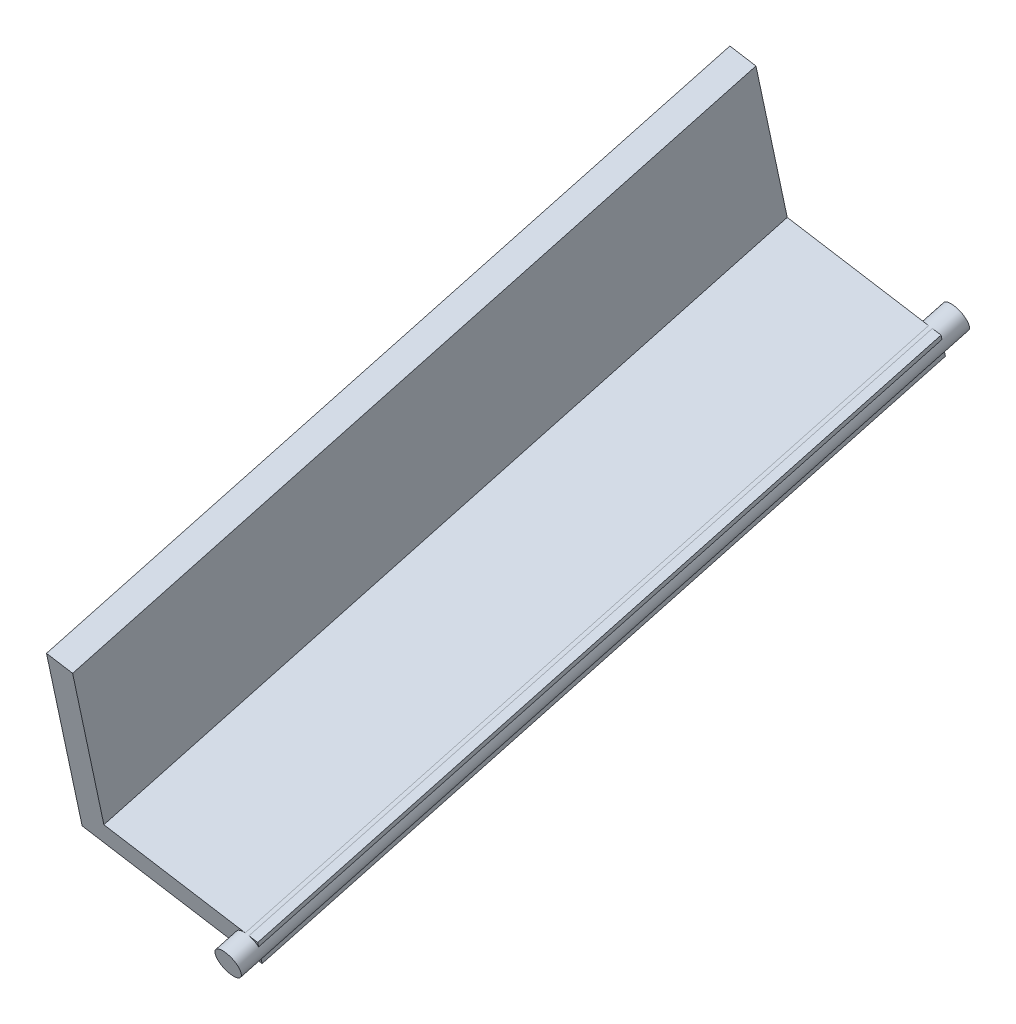
ISO-10303-21;
HEADER;
FILE_DESCRIPTION(('STEP AP214'),'2;1');
FILE_NAME('part.step','',(''),(''),'','','');
FILE_SCHEMA(('AUTOMOTIVE_DESIGN { 1 0 10303 214 1 1 1 1 }'));
ENDSEC;
DATA;
#1=APPLICATION_CONTEXT('core data for automotive mechanical design processes');
#2=APPLICATION_PROTOCOL_DEFINITION('international standard','automotive_design',2000,#1);
#3=PRODUCT_CONTEXT('',#1,'mechanical');
#4=PRODUCT('Part','Part','',(#3));
#5=PRODUCT_RELATED_PRODUCT_CATEGORY('part','',(#4));
#6=PRODUCT_DEFINITION_FORMATION('','',#4);
#7=PRODUCT_DEFINITION_CONTEXT('part definition',#1,'design');
#8=PRODUCT_DEFINITION('design','',#6,#7);
#9=PRODUCT_DEFINITION_SHAPE('','',#8);
#10=(LENGTH_UNIT() NAMED_UNIT(*) SI_UNIT(.MILLI.,.METRE.));
#11=(NAMED_UNIT(*) PLANE_ANGLE_UNIT() SI_UNIT($,.RADIAN.));
#12=(NAMED_UNIT(*) SI_UNIT($,.STERADIAN.) SOLID_ANGLE_UNIT());
#13=UNCERTAINTY_MEASURE_WITH_UNIT(LENGTH_MEASURE(1.E-05),#10,'distance_accuracy_value','');
#14=(GEOMETRIC_REPRESENTATION_CONTEXT(3) GLOBAL_UNCERTAINTY_ASSIGNED_CONTEXT((#13)) GLOBAL_UNIT_ASSIGNED_CONTEXT((#10,
#11,#12)) REPRESENTATION_CONTEXT('',''));
#15=CARTESIAN_POINT('',(0.,0.,0.));
#16=DIRECTION('',(0.,0.,1.));
#17=DIRECTION('',(1.,0.,0.));
#18=AXIS2_PLACEMENT_3D('',#15,#16,#17);
#19=CARTESIAN_POINT('',(135.49736529389,98.8824306192321,600.542544639561));
#20=DIRECTION('',(-0.0498209439146007,-0.318543912482936,0.94659793437738));
#21=DIRECTION('',(-0.986353849872011,0.164602515056017,0.00347776938496755));
#22=AXIS2_PLACEMENT_3D('',#19,#20,#21);
#23=PLANE('',#22);
#24=CARTESIAN_POINT('',(131.867470112503,96.4411580823011,599.529973964316));
#25=DIRECTION('',(-0.0498209439144848,-0.318543912482891,0.946597934377401));
#26=DIRECTION('',(0.,-0.947774913776361,-0.318939983094331));
#27=AXIS2_PLACEMENT_3D('',#24,#25,#26);
#28=CIRCLE('',#27,3.17499999999999);
#29=CARTESIAN_POINT('',(131.867470112503,93.4319727310612,598.517339517991));
#30=VERTEX_POINT('',#29);
#31=EDGE_CURVE('P0_E18',#30,#30,#28,.F.);
#32=ORIENTED_EDGE('',*,*,#31,.F.);
#33=EDGE_LOOP('',(#32));
#34=FACE_BOUND('',#33,.T.);
#35=ADVANCED_FACE('P0_F14',(#34),#23,.T.);
#36=CARTESIAN_POINT('',(143.264621387282,148.987783603308,431.985028772621));
#37=DIRECTION('',(0.0498209439146288,0.318543912482924,-0.946597934377382));
#38=DIRECTION('',(-0.986353849872009,0.164602515056032,0.00347776938494136));
#39=AXIS2_PLACEMENT_3D('',#36,#37,#38);
#40=PLANE('',#39);
#41=CARTESIAN_POINT('',(140.631169622001,152.474282110855,433.019683283465));
#42=DIRECTION('',(-0.0498209439144848,-0.318543912482891,0.946597934377401));
#43=DIRECTION('',(0.,-0.947774913776361,-0.318939983094331));
#44=AXIS2_PLACEMENT_3D('',#41,#42,#43);
#45=CIRCLE('',#44,3.17499999999999);
#46=CARTESIAN_POINT('',(140.631169622001,149.465096759615,432.00704883714));
#47=VERTEX_POINT('',#46);
#48=EDGE_CURVE('P0_E10',#47,#47,#45,.T.);
#49=ORIENTED_EDGE('',*,*,#48,.F.);
#50=EDGE_LOOP('',(#49));
#51=FACE_BOUND('',#50,.T.);
#52=ADVANCED_FACE('P0_F29',(#51),#40,.T.);
#53=CARTESIAN_POINT('',(140.631169622001,152.474282110855,433.019683283465));
#54=DIRECTION('',(-0.0498209439144848,-0.318543912482891,0.946597934377401));
#55=DIRECTION('',(0.,-0.947774913776361,-0.318939983094331));
#56=AXIS2_PLACEMENT_3D('',#53,#54,#55);
#57=CYLINDRICAL_SURFACE('',#56,3.17499999999999);
#58=ORIENTED_EDGE('',*,*,#31,.T.);
#59=EDGE_LOOP('',(#58));
#60=FACE_BOUND('',#59,.T.);
#61=ORIENTED_EDGE('',*,*,#48,.T.);
#62=EDGE_LOOP('',(#61));
#63=FACE_BOUND('',#62,.T.);
#64=ADVANCED_FACE('P0_F16',(#60,#63),#57,.T.);
#65=CLOSED_SHELL('',(#35,#52,#64));
#66=MANIFOLD_SOLID_BREP('P0_B1',#65);
#67=CARTESIAN_POINT('',(134.178484930313,94.6374337130501,593.668993032227));
#68=DIRECTION('',(0.0498209205864811,0.31854391637594,-0.946597934295123));
#69=DIRECTION('',(-0.98635385105032,0.164602507522178,0.00347779177282726));
#70=AXIS2_PLACEMENT_3D('',#67,#68,#69);
#71=PLANE('',#70);
#72=DIRECTION('',(-0.156920223011995,-0.933507251100535,-0.322397667101654));
#73=VECTOR('',#72,1.);
#74=CARTESIAN_POINT('',(134.676706638376,97.6013192352939,594.692605625277));
#75=LINE('',#74,#73);
#76=CARTESIAN_POINT('',(135.174928346438,100.565204757538,595.716218218324));
#77=VERTEX_POINT('',#76);
#78=CARTESIAN_POINT('',(134.17848493114,94.6374337183536,593.668993015742));
#79=VERTEX_POINT('',#78);
#80=EDGE_CURVE('P1_E143',#77,#79,#75,.T.);
#81=ORIENTED_EDGE('',*,*,#80,.F.);
#82=DIRECTION('',(0.98635385105032,-0.164602507522177,-0.00347779177281395));
#83=VECTOR('',#82,1.);
#84=CARTESIAN_POINT('',(116.725209396433,103.644089682068,595.781270208244));
#85=LINE('',#84,#83);
#86=CARTESIAN_POINT('',(98.2754904464275,106.722974606597,595.846322198162));
#87=VERTEX_POINT('',#86);
#88=EDGE_CURVE('P1_E155',#87,#77,#85,.T.);
#89=ORIENTED_EDGE('',*,*,#88,.F.);
#90=DIRECTION('',(-0.156920223011969,-0.933507251100538,-0.322397667101656));
#91=VECTOR('',#90,1.);
#92=CARTESIAN_POINT('',(101.844907972853,127.957185718248,603.179805807495));
#93=LINE('',#92,#91);
#94=CARTESIAN_POINT('',(105.414325499278,149.191396829899,610.513289416829));
#95=VERTEX_POINT('',#94);
#96=EDGE_CURVE('P1_E163',#95,#87,#93,.T.);
#97=ORIENTED_EDGE('',*,*,#96,.F.);
#98=DIRECTION('',(0.986353851050317,-0.164602507522197,-0.0034777917728332));
#99=VECTOR('',#98,1.);
#100=CARTESIAN_POINT('',(102.282652022193,149.714009791282,610.524331405707));
#101=LINE('',#100,#99);
#102=CARTESIAN_POINT('',(99.1509785451081,150.236622752665,610.535373394586));
#103=VERTEX_POINT('',#102);
#104=EDGE_CURVE('P1_E92',#103,#95,#101,.T.);
#105=ORIENTED_EDGE('',*,*,#104,.F.);
#106=DIRECTION('',(0.156920223011939,0.933507251100546,0.322397667101649));
#107=VECTOR('',#106,1.);
#108=CARTESIAN_POINT('',(95.5815610186831,129.002411641015,603.201889785252));
#109=LINE('',#108,#107);
#110=CARTESIAN_POINT('',(92.0119416850488,107.768234206907,595.868406887467));
#111=VERTEX_POINT('',#110);
#112=EDGE_CURVE('P1_E89',#111,#103,#109,.T.);
#113=ORIENTED_EDGE('',*,*,#112,.F.);
#114=DIRECTION('',(0.156920223011983,0.933507251100522,0.322397667101696));
#115=VECTOR('',#114,1.);
#116=CARTESIAN_POINT('',(91.5135181697758,104.804382362202,594.844795005978));
#117=LINE('',#116,#115);
#118=CARTESIAN_POINT('',(91.0152964608829,101.84049683463,593.821182429492));
#119=VERTEX_POINT('',#118);
#120=EDGE_CURVE('P1_E74',#119,#111,#117,.T.);
#121=ORIENTED_EDGE('',*,*,#120,.F.);
#122=DIRECTION('',(-0.98635385110461,0.164602507172809,0.00347779291085489));
#123=VECTOR('',#122,1.);
#124=CARTESIAN_POINT('',(112.645479282485,98.2308568241855,593.744916403752));
#125=LINE('',#124,#123);
#126=EDGE_CURVE('P1_E139',#79,#119,#125,.T.);
#127=ORIENTED_EDGE('',*,*,#126,.F.);
#128=EDGE_LOOP('',(#81,#89,#97,#105,#113,#121,#127));
#129=FACE_BOUND('',#128,.T.);
#130=ADVANCED_FACE('P1_F16',(#129),#71,.F.);
#131=CARTESIAN_POINT('',(100.236478552822,160.355372500133,439.598445247426));
#132=DIRECTION('',(-0.986353848704734,0.164602522519324,0.00347774720676038));
#133=DIRECTION('',(-0.156920223011967,-0.933507251100544,-0.322397667101641));
#134=AXIS2_PLACEMENT_3D('',#131,#132,#133);
#135=PLANE('',#134);
#136=ORIENTED_EDGE('',*,*,#120,.T.);
#137=CARTESIAN_POINT('',(100.236882167242,160.355305145051,439.598443824319));
#138=DIRECTION('',(-0.0498209670242729,-0.318543908626413,0.946597934458856));
#139=VECTOR('',#138,1.);
#140=LINE('',#137,#139);
#141=CARTESIAN_POINT('',(100.236680360033,160.355338822593,439.598444535868));
#142=VERTEX_POINT('',#141);
#143=EDGE_CURVE('P1_E79',#142,#111,#140,.T.);
#144=ORIENTED_EDGE('',*,*,#143,.F.);
#145=DIRECTION('',(0.15692022301197,0.933507251100538,0.322397667101658));
#146=VECTOR('',#145,1.);
#147=CARTESIAN_POINT('',(103.307674371185,178.625698089539,445.908316263713));
#148=LINE('',#147,#146);
#149=CARTESIAN_POINT('',(99.2400351366972,154.427601455644,437.551220061331));
#150=VERTEX_POINT('',#149);
#151=EDGE_CURVE('P1_E141',#150,#142,#148,.T.);
#152=ORIENTED_EDGE('',*,*,#151,.F.);
#153=DIRECTION('',(0.049820967024273,0.318543908626413,-0.946597934458856));
#154=VECTOR('',#153,1.);
#155=CARTESIAN_POINT('',(95.1276657992058,128.134049147801,515.686201237132));
#156=LINE('',#155,#154);
#157=EDGE_CURVE('P1_E83',#119,#150,#156,.T.);
#158=ORIENTED_EDGE('',*,*,#157,.F.);
#159=EDGE_LOOP('',(#136,#144,#152,#158));
#160=FACE_BOUND('',#159,.T.);
#161=ADVANCED_FACE('P1_F76',(#160),#135,.T.);
#162=CARTESIAN_POINT('',(107.375717220091,202.823727368353,454.265411042987));
#163=DIRECTION('',(-0.986353848704738,0.164602522519304,0.0034777472067533));
#164=DIRECTION('',(-0.156920223011944,-0.933507251100541,-0.322397667101661));
#165=AXIS2_PLACEMENT_3D('',#162,#163,#164);
#166=PLANE('',#165);
#167=ORIENTED_EDGE('',*,*,#112,.T.);
#168=DIRECTION('',(-0.049820967024273,-0.318543908626413,0.946597934458856));
#169=VECTOR('',#168,1.);
#170=CARTESIAN_POINT('',(103.2633478826,176.530175060508,532.400392218786));
#171=LINE('',#170,#169);
#172=CARTESIAN_POINT('',(107.375717220092,202.823727368351,454.265411042987));
#173=VERTEX_POINT('',#172);
#174=EDGE_CURVE('P1_E95',#173,#103,#171,.T.);
#175=ORIENTED_EDGE('',*,*,#174,.F.);
#176=DIRECTION('',(0.156920223011973,0.933507251100535,0.322397667101664));
#177=VECTOR('',#176,1.);
#178=CARTESIAN_POINT('',(103.308077985604,178.625630734457,445.908314840606));
#179=LINE('',#178,#177);
#180=EDGE_CURVE('P1_E99',#142,#173,#179,.T.);
#181=ORIENTED_EDGE('',*,*,#180,.F.);
#182=ORIENTED_EDGE('',*,*,#143,.T.);
#183=EDGE_LOOP('',(#167,#175,#181,#182));
#184=FACE_BOUND('',#183,.T.);
#185=ADVANCED_FACE('P1_F97',(#184),#166,.T.);
#186=CARTESIAN_POINT('',(113.639064174262,201.778501445586,454.243327065229));
#187=DIRECTION('',(0.156920223011942,0.933507251100542,0.32239766710166));
#188=DIRECTION('',(-0.98635385105032,0.164602507522179,0.00347779177280696));
#189=AXIS2_PLACEMENT_3D('',#186,#187,#188);
#190=PLANE('',#189);
#191=ORIENTED_EDGE('',*,*,#104,.T.);
#192=DIRECTION('',(-0.0498209670242729,-0.318543908626413,0.946597934458856));
#193=VECTOR('',#192,1.);
#194=CARTESIAN_POINT('',(109.52669483677,175.484949137742,532.37830824103));
#195=LINE('',#194,#193);
#196=CARTESIAN_POINT('',(113.639064174262,201.778501445586,454.24332706523));
#197=VERTEX_POINT('',#196);
#198=EDGE_CURVE('P1_E165',#197,#95,#195,.T.);
#199=ORIENTED_EDGE('',*,*,#198,.F.);
#200=DIRECTION('',(0.986353851050323,-0.164602507522157,-0.00347779177280873));
#201=VECTOR('',#200,1.);
#202=CARTESIAN_POINT('',(128.956907839972,199.222263159981,454.189317775743));
#203=LINE('',#202,#201);
#204=EDGE_CURVE('P1_E168',#173,#197,#203,.T.);
#205=ORIENTED_EDGE('',*,*,#204,.F.);
#206=ORIENTED_EDGE('',*,*,#174,.T.);
#207=EDGE_LOOP('',(#191,#199,#205,#206));
#208=FACE_BOUND('',#207,.T.);
#209=ADVANCED_FACE('P1_F117',(#208),#190,.T.);
#210=CARTESIAN_POINT('',(106.500229121412,159.310079222284,439.576359846562));
#211=DIRECTION('',(0.986353848704737,-0.164602522519305,-0.0034777472067537));
#212=DIRECTION('',(0.156920223011945,0.933507251100541,0.32239766710166));
#213=AXIS2_PLACEMENT_3D('',#210,#211,#212);
#214=PLANE('',#213);
#215=ORIENTED_EDGE('',*,*,#96,.T.);
#216=DIRECTION('',(-0.049820967024273,-0.318543908626414,0.946597934458856));
#217=VECTOR('',#216,1.);
#218=CARTESIAN_POINT('',(102.387859783919,133.016526914441,517.711341022363));
#219=LINE('',#218,#217);
#220=CARTESIAN_POINT('',(106.500229121411,159.310079222284,439.576359846562));
#221=VERTEX_POINT('',#220);
#222=EDGE_CURVE('P1_E157',#221,#87,#219,.T.);
#223=ORIENTED_EDGE('',*,*,#222,.F.);
#224=DIRECTION('',(-0.156920223011968,-0.933507251100536,-0.322397667101662));
#225=VECTOR('',#224,1.);
#226=CARTESIAN_POINT('',(109.571424939774,177.580404811691,445.886230862848));
#227=LINE('',#226,#225);
#228=EDGE_CURVE('P1_E160',#197,#221,#227,.T.);
#229=ORIENTED_EDGE('',*,*,#228,.F.);
#230=ORIENTED_EDGE('',*,*,#198,.T.);
#231=EDGE_LOOP('',(#215,#223,#229,#230));
#232=FACE_BOUND('',#231,.T.);
#233=ADVANCED_FACE('P1_F120',(#232),#214,.T.);
#234=CARTESIAN_POINT('',(143.399667021421,153.152309373226,439.446255866726));
#235=DIRECTION('',(0.156920223011947,0.933507251100541,0.322397667101659));
#236=DIRECTION('',(-0.986353851050319,0.164602507522179,0.00347779177282272));
#237=AXIS2_PLACEMENT_3D('',#234,#235,#236);
#238=PLANE('',#237);
#239=ORIENTED_EDGE('',*,*,#88,.T.);
#240=DIRECTION('',(-0.0498209670242729,-0.318543908626413,0.946597934458857));
#241=VECTOR('',#240,1.);
#242=CARTESIAN_POINT('',(139.287297683931,126.858757065381,517.581237042525));
#243=LINE('',#242,#241);
#244=CARTESIAN_POINT('',(143.399667021422,153.152309373225,439.446255866724));
#245=VERTEX_POINT('',#244);
#246=EDGE_CURVE('P1_E149',#245,#77,#243,.T.);
#247=ORIENTED_EDGE('',*,*,#246,.F.);
#248=DIRECTION('',(0.986353851050321,-0.164602507522171,-0.00347779177281976));
#249=VECTOR('',#248,1.);
#250=CARTESIAN_POINT('',(121.818072787123,156.753840936679,439.522350557075));
#251=LINE('',#250,#249);
#252=EDGE_CURVE('P1_E152',#221,#245,#251,.T.);
#253=ORIENTED_EDGE('',*,*,#252,.F.);
#254=ORIENTED_EDGE('',*,*,#222,.T.);
#255=EDGE_LOOP('',(#239,#247,#253,#254));
#256=FACE_BOUND('',#255,.T.);
#257=ADVANCED_FACE('P1_F124',(#256),#238,.T.);
#258=CARTESIAN_POINT('',(142.403223605296,147.224538328736,437.39903068063));
#259=DIRECTION('',(0.986353848704735,-0.164602522519317,-0.00347774720675811));
#260=DIRECTION('',(0.156920223011958,0.933507251100536,0.322397667101667));
#261=AXIS2_PLACEMENT_3D('',#258,#259,#260);
#262=PLANE('',#261);
#263=ORIENTED_EDGE('',*,*,#80,.T.);
#264=DIRECTION('',(-0.0498209670242729,-0.318543908626413,0.946597934458856));
#265=VECTOR('',#264,1.);
#266=CARTESIAN_POINT('',(138.290854267805,120.930986020893,515.534011856429));
#267=LINE('',#266,#265);
#268=CARTESIAN_POINT('',(142.403223605415,147.224538329494,437.399030678379));
#269=VERTEX_POINT('',#268);
#270=EDGE_CURVE('P1_E37',#269,#79,#267,.T.);
#271=ORIENTED_EDGE('',*,*,#270,.F.);
#272=DIRECTION('',(-0.156920223011972,-0.933507251100537,-0.322397667101659));
#273=VECTOR('',#272,1.);
#274=CARTESIAN_POINT('',(146.470862839784,171.422634962632,445.75612688301));
#275=LINE('',#274,#273);
#276=EDGE_CURVE('P1_E28',#245,#269,#275,.T.);
#277=ORIENTED_EDGE('',*,*,#276,.F.);
#278=ORIENTED_EDGE('',*,*,#246,.T.);
#279=EDGE_LOOP('',(#263,#271,#277,#278));
#280=FACE_BOUND('',#279,.T.);
#281=ADVANCED_FACE('P1_F128',(#280),#262,.T.);
#282=CARTESIAN_POINT('',(99.2400351366976,154.427601455644,437.551220061332));
#283=DIRECTION('',(-0.156920223011949,-0.933507251100541,-0.322397667101659));
#284=DIRECTION('',(0.986353851050319,-0.16460250752218,-0.00347779177282727));
#285=AXIS2_PLACEMENT_3D('',#282,#283,#284);
#286=PLANE('',#285);
#287=ORIENTED_EDGE('',*,*,#126,.T.);
#288=ORIENTED_EDGE('',*,*,#157,.T.);
#289=DIRECTION('',(-0.986353851050321,0.16460250752217,0.00347779177281978));
#290=VECTOR('',#289,1.);
#291=CARTESIAN_POINT('',(120.821629370997,150.826069892191,437.475125370979));
#292=LINE('',#291,#290);
#293=EDGE_CURVE('P1_E11',#269,#150,#292,.T.);
#294=ORIENTED_EDGE('',*,*,#293,.F.);
#295=ORIENTED_EDGE('',*,*,#270,.T.);
#296=EDGE_LOOP('',(#287,#288,#294,#295));
#297=FACE_BOUND('',#296,.T.);
#298=ADVANCED_FACE('P1_F131',(#297),#286,.T.);
#299=CARTESIAN_POINT('',(142.403223605297,147.224538328737,437.399030680628));
#300=DIRECTION('',(0.0498209205864826,0.318543916375943,-0.946597934295122));
#301=DIRECTION('',(-0.98635385105032,0.164602507522177,0.00347779177282599));
#302=AXIS2_PLACEMENT_3D('',#299,#300,#301);
#303=PLANE('',#302);
#304=ORIENTED_EDGE('',*,*,#276,.T.);
#305=ORIENTED_EDGE('',*,*,#293,.T.);
#306=ORIENTED_EDGE('',*,*,#151,.T.);
#307=ORIENTED_EDGE('',*,*,#180,.T.);
#308=ORIENTED_EDGE('',*,*,#204,.T.);
#309=ORIENTED_EDGE('',*,*,#228,.T.);
#310=ORIENTED_EDGE('',*,*,#252,.T.);
#311=EDGE_LOOP('',(#304,#305,#306,#307,#308,#309,#310));
#312=FACE_BOUND('',#311,.T.);
#313=ADVANCED_FACE('P1_F18',(#312),#303,.T.);
#314=CLOSED_SHELL('',(#130,#161,#185,#209,#233,#257,#281,#298,#313));
#315=MANIFOLD_SOLID_BREP('P1_B1',#314);
#316=ADVANCED_BREP_SHAPE_REPRESENTATION('',(#18,#66,#315),#14);
#317=SHAPE_DEFINITION_REPRESENTATION(#9,#316);
ENDSEC;
END-ISO-10303-21;
